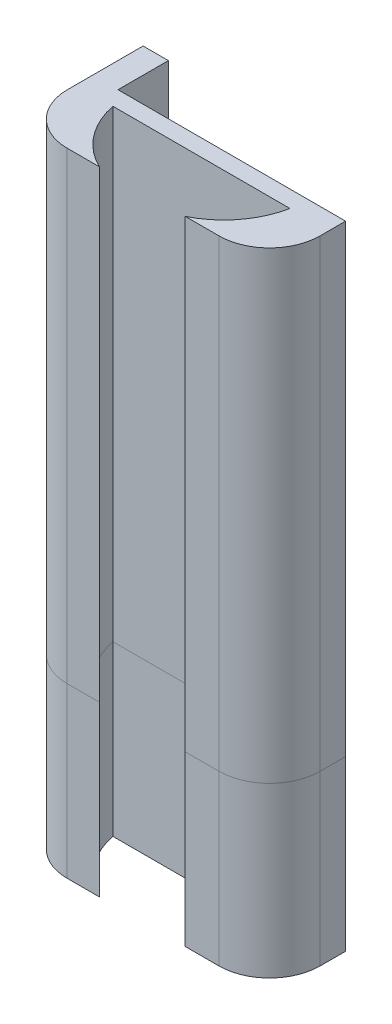
ISO-10303-21;
HEADER;
FILE_DESCRIPTION(('STEP AP214'),'2;1');
FILE_NAME('part.step','',(''),(''),'','','');
FILE_SCHEMA(('AUTOMOTIVE_DESIGN { 1 0 10303 214 1 1 1 1 }'));
ENDSEC;
DATA;
#1=APPLICATION_CONTEXT('core data for automotive mechanical design processes');
#2=APPLICATION_PROTOCOL_DEFINITION('international standard','automotive_design',2000,#1);
#3=PRODUCT_CONTEXT('',#1,'mechanical');
#4=PRODUCT('Part','Part','',(#3));
#5=PRODUCT_RELATED_PRODUCT_CATEGORY('part','',(#4));
#6=PRODUCT_DEFINITION_FORMATION('','',#4);
#7=PRODUCT_DEFINITION_CONTEXT('part definition',#1,'design');
#8=PRODUCT_DEFINITION('design','',#6,#7);
#9=PRODUCT_DEFINITION_SHAPE('','',#8);
#10=(LENGTH_UNIT() NAMED_UNIT(*) SI_UNIT(.MILLI.,.METRE.));
#11=(NAMED_UNIT(*) PLANE_ANGLE_UNIT() SI_UNIT($,.RADIAN.));
#12=(NAMED_UNIT(*) SI_UNIT($,.STERADIAN.) SOLID_ANGLE_UNIT());
#13=UNCERTAINTY_MEASURE_WITH_UNIT(LENGTH_MEASURE(1.E-05),#10,'distance_accuracy_value','');
#14=(GEOMETRIC_REPRESENTATION_CONTEXT(3) GLOBAL_UNCERTAINTY_ASSIGNED_CONTEXT((#13)) GLOBAL_UNIT_ASSIGNED_CONTEXT((#10,
#11,#12)) REPRESENTATION_CONTEXT('',''));
#15=CARTESIAN_POINT('',(0.,0.,0.));
#16=DIRECTION('',(0.,0.,1.));
#17=DIRECTION('',(1.,0.,0.));
#18=AXIS2_PLACEMENT_3D('',#15,#16,#17);
#19=CARTESIAN_POINT('',(-15.,-17.5,15.01));
#20=DIRECTION('',(0.,1.,0.));
#21=DIRECTION('',(0.,0.,1.));
#22=AXIS2_PLACEMENT_3D('',#19,#20,#21);
#23=PLANE('',#22);
#24=DIRECTION('',(1.,0.,0.));
#25=VECTOR('',#24,1.);
#26=CARTESIAN_POINT('',(12.,-17.5,5.98));
#27=LINE('',#26,#25);
#28=CARTESIAN_POINT('',(-12.,-17.5,5.98));
#29=VERTEX_POINT('',#28);
#30=CARTESIAN_POINT('',(15.,-17.5,5.98));
#31=VERTEX_POINT('',#30);
#32=EDGE_CURVE('E156',#29,#31,#27,.T.);
#33=ORIENTED_EDGE('',*,*,#32,.F.);
#34=DIRECTION('',(0.,0.,-1.));
#35=VECTOR('',#34,1.);
#36=CARTESIAN_POINT('',(-12.,-17.5,0.));
#37=LINE('',#36,#35);
#38=CARTESIAN_POINT('',(-12.,-17.5,0.));
#39=VERTEX_POINT('',#38);
#40=EDGE_CURVE('E166',#29,#39,#37,.T.);
#41=ORIENTED_EDGE('',*,*,#40,.T.);
#42=DIRECTION('',(1.,0.,0.));
#43=VECTOR('',#42,1.);
#44=CARTESIAN_POINT('',(0.,-17.5,0.));
#45=LINE('',#44,#43);
#46=CARTESIAN_POINT('',(-15.,-17.5,0.));
#47=VERTEX_POINT('',#46);
#48=EDGE_CURVE('E170',#47,#39,#45,.T.);
#49=ORIENTED_EDGE('',*,*,#48,.F.);
#50=DIRECTION('',(0.,0.,-1.));
#51=VECTOR('',#50,1.);
#52=CARTESIAN_POINT('',(-15.,-17.5,15.));
#53=LINE('',#52,#51);
#54=CARTESIAN_POINT('',(-15.,-17.5,9.));
#55=VERTEX_POINT('',#54);
#56=EDGE_CURVE('E258',#55,#47,#53,.T.);
#57=ORIENTED_EDGE('',*,*,#56,.F.);
#58=CARTESIAN_POINT('',(-9.,-17.5,9.));
#59=DIRECTION('',(0.,1.,0.));
#60=DIRECTION('',(0.,0.,1.));
#61=AXIS2_PLACEMENT_3D('',#58,#59,#60);
#62=CIRCLE('',#61,6.);
#63=CARTESIAN_POINT('',(-9.,-17.5,15.));
#64=VERTEX_POINT('',#63);
#65=EDGE_CURVE('E249',#64,#55,#62,.F.);
#66=ORIENTED_EDGE('',*,*,#65,.F.);
#67=DIRECTION('',(1.,0.,0.));
#68=VECTOR('',#67,1.);
#69=CARTESIAN_POINT('',(0.,-17.5,15.));
#70=LINE('',#69,#68);
#71=CARTESIAN_POINT('',(-5.2,-17.5,15.));
#72=VERTEX_POINT('',#71);
#73=EDGE_CURVE('E176',#64,#72,#70,.T.);
#74=ORIENTED_EDGE('',*,*,#73,.T.);
#75=CARTESIAN_POINT('',(-0.793300427736587,-17.5,6.02330802133584));
#76=DIRECTION('',(0.,1.,0.));
#77=DIRECTION('',(0.,0.,1.));
#78=AXIS2_PLACEMENT_3D('',#75,#76,#77);
#79=CIRCLE('',#78,10.);
#80=CARTESIAN_POINT('',(-10.6,-17.5,7.98));
#81=VERTEX_POINT('',#80);
#82=EDGE_CURVE('E253',#81,#72,#79,.T.);
#83=ORIENTED_EDGE('',*,*,#82,.F.);
#84=DIRECTION('',(-1.,0.,0.));
#85=VECTOR('',#84,1.);
#86=CARTESIAN_POINT('',(0.,-17.5,7.98));
#87=LINE('',#86,#85);
#88=CARTESIAN_POINT('',(10.4,-17.5,7.98));
#89=VERTEX_POINT('',#88);
#90=EDGE_CURVE('E251',#89,#81,#87,.T.);
#91=ORIENTED_EDGE('',*,*,#90,.F.);
#92=CARTESIAN_POINT('',(0.593300427736594,-17.5,6.02330802133584));
#93=DIRECTION('',(0.,1.,0.));
#94=DIRECTION('',(0.,0.,1.));
#95=AXIS2_PLACEMENT_3D('',#92,#93,#94);
#96=CIRCLE('',#95,10.);
#97=CARTESIAN_POINT('',(5.,-17.5,15.));
#98=VERTEX_POINT('',#97);
#99=EDGE_CURVE('E169',#98,#89,#96,.T.);
#100=ORIENTED_EDGE('',*,*,#99,.F.);
#101=DIRECTION('',(1.,0.,0.));
#102=VECTOR('',#101,1.);
#103=CARTESIAN_POINT('',(0.,-17.5,15.));
#104=LINE('',#103,#102);
#105=CARTESIAN_POINT('',(9.,-17.5,15.));
#106=VERTEX_POINT('',#105);
#107=EDGE_CURVE('E261',#98,#106,#104,.T.);
#108=ORIENTED_EDGE('',*,*,#107,.T.);
#109=CARTESIAN_POINT('',(9.,-17.5,9.));
#110=DIRECTION('',(0.,1.,0.));
#111=DIRECTION('',(0.,0.,1.));
#112=AXIS2_PLACEMENT_3D('',#109,#110,#111);
#113=CIRCLE('',#112,6.);
#114=CARTESIAN_POINT('',(15.,-17.5,9.));
#115=VERTEX_POINT('',#114);
#116=EDGE_CURVE('E183',#115,#106,#113,.F.);
#117=ORIENTED_EDGE('',*,*,#116,.F.);
#118=DIRECTION('',(0.,0.,-1.));
#119=VECTOR('',#118,1.);
#120=CARTESIAN_POINT('',(15.,-17.5,15.));
#121=LINE('',#120,#119);
#122=EDGE_CURVE('E168',#115,#31,#121,.T.);
#123=ORIENTED_EDGE('',*,*,#122,.T.);
#124=EDGE_LOOP('',(#33,#41,#49,#57,#66,#74,#83,#91,#100,#108,#117,#123));
#125=FACE_BOUND('',#124,.T.);
#126=ADVANCED_FACE('F49',(#125),#23,.T.);
#127=CARTESIAN_POINT('',(0.,0.,0.));
#128=DIRECTION('',(0.,0.,-1.));
#129=DIRECTION('',(-1.,0.,0.));
#130=AXIS2_PLACEMENT_3D('',#127,#128,#129);
#131=PLANE('',#130);
#132=DIRECTION('',(0.,1.,0.));
#133=VECTOR('',#132,1.);
#134=CARTESIAN_POINT('',(-15.,-37.5,0.));
#135=LINE('',#134,#133);
#136=CARTESIAN_POINT('',(-15.,-37.5,0.));
#137=VERTEX_POINT('',#136);
#138=EDGE_CURVE('E194',#137,#47,#135,.T.);
#139=ORIENTED_EDGE('',*,*,#138,.T.);
#140=ORIENTED_EDGE('',*,*,#48,.T.);
#141=DIRECTION('',(0.,1.,0.));
#142=VECTOR('',#141,1.);
#143=CARTESIAN_POINT('',(-12.,-37.5,0.));
#144=LINE('',#143,#142);
#145=CARTESIAN_POINT('',(-12.,-37.5,0.));
#146=VERTEX_POINT('',#145);
#147=EDGE_CURVE('E163',#146,#39,#144,.T.);
#148=ORIENTED_EDGE('',*,*,#147,.F.);
#149=DIRECTION('',(-1.,0.,0.));
#150=VECTOR('',#149,1.);
#151=CARTESIAN_POINT('',(15.,-37.5,0.));
#152=LINE('',#151,#150);
#153=EDGE_CURVE('E197',#146,#137,#152,.T.);
#154=ORIENTED_EDGE('',*,*,#153,.T.);
#155=EDGE_LOOP('',(#139,#140,#148,#154));
#156=FACE_BOUND('',#155,.T.);
#157=ADVANCED_FACE('F314',(#156),#131,.T.);
#158=CARTESIAN_POINT('',(15.,-37.5,15.));
#159=DIRECTION('',(0.,-1.,0.));
#160=DIRECTION('',(0.,0.,-1.));
#161=AXIS2_PLACEMENT_3D('',#158,#159,#160);
#162=PLANE('',#161);
#163=DIRECTION('',(-1.,0.,0.));
#164=VECTOR('',#163,1.);
#165=CARTESIAN_POINT('',(12.,-37.5,5.98));
#166=LINE('',#165,#164);
#167=CARTESIAN_POINT('',(15.,-37.5,5.98));
#168=VERTEX_POINT('',#167);
#169=CARTESIAN_POINT('',(-12.,-37.5,5.98));
#170=VERTEX_POINT('',#169);
#171=EDGE_CURVE('E158',#168,#170,#166,.T.);
#172=ORIENTED_EDGE('',*,*,#171,.F.);
#173=DIRECTION('',(0.,0.,-1.));
#174=VECTOR('',#173,1.);
#175=CARTESIAN_POINT('',(15.,-37.5,15.));
#176=LINE('',#175,#174);
#177=CARTESIAN_POINT('',(15.,-37.5,9.));
#178=VERTEX_POINT('',#177);
#179=EDGE_CURVE('E193',#178,#168,#176,.T.);
#180=ORIENTED_EDGE('',*,*,#179,.F.);
#181=CARTESIAN_POINT('',(9.,-37.5,9.));
#182=DIRECTION('',(0.,-1.,0.));
#183=DIRECTION('',(0.,0.,-1.));
#184=AXIS2_PLACEMENT_3D('',#181,#182,#183);
#185=CIRCLE('',#184,6.);
#186=CARTESIAN_POINT('',(9.,-37.5,15.));
#187=VERTEX_POINT('',#186);
#188=EDGE_CURVE('E190',#178,#187,#185,.T.);
#189=ORIENTED_EDGE('',*,*,#188,.T.);
#190=DIRECTION('',(-1.,0.,0.));
#191=VECTOR('',#190,1.);
#192=CARTESIAN_POINT('',(15.,-37.5,15.));
#193=LINE('',#192,#191);
#194=CARTESIAN_POINT('',(5.,-37.5,15.));
#195=VERTEX_POINT('',#194);
#196=EDGE_CURVE('E291',#187,#195,#193,.T.);
#197=ORIENTED_EDGE('',*,*,#196,.T.);
#198=CARTESIAN_POINT('',(0.593300427736594,-37.5,6.02330802133584));
#199=DIRECTION('',(0.,1.,0.));
#200=DIRECTION('',(0.,0.,1.));
#201=AXIS2_PLACEMENT_3D('',#198,#199,#200);
#202=CIRCLE('',#201,10.);
#203=CARTESIAN_POINT('',(10.4,-37.5,7.98));
#204=VERTEX_POINT('',#203);
#205=EDGE_CURVE('E216',#204,#195,#202,.F.);
#206=ORIENTED_EDGE('',*,*,#205,.F.);
#207=DIRECTION('',(1.,0.,0.));
#208=VECTOR('',#207,1.);
#209=CARTESIAN_POINT('',(0.,-37.5,7.98));
#210=LINE('',#209,#208);
#211=CARTESIAN_POINT('',(-10.6,-37.5,7.98));
#212=VERTEX_POINT('',#211);
#213=EDGE_CURVE('E221',#212,#204,#210,.T.);
#214=ORIENTED_EDGE('',*,*,#213,.F.);
#215=CARTESIAN_POINT('',(-0.793300427736587,-37.5,6.02330802133584));
#216=DIRECTION('',(0.,1.,0.));
#217=DIRECTION('',(0.,0.,1.));
#218=AXIS2_PLACEMENT_3D('',#215,#216,#217);
#219=CIRCLE('',#218,10.);
#220=CARTESIAN_POINT('',(-5.2,-37.5,15.));
#221=VERTEX_POINT('',#220);
#222=EDGE_CURVE('E211',#221,#212,#219,.F.);
#223=ORIENTED_EDGE('',*,*,#222,.F.);
#224=CARTESIAN_POINT('',(-9.,-37.5,15.));
#225=VERTEX_POINT('',#224);
#226=EDGE_CURVE('E198',#221,#225,#193,.T.);
#227=ORIENTED_EDGE('',*,*,#226,.T.);
#228=CARTESIAN_POINT('',(-9.,-37.5,9.));
#229=DIRECTION('',(0.,-1.,0.));
#230=DIRECTION('',(0.,0.,-1.));
#231=AXIS2_PLACEMENT_3D('',#228,#229,#230);
#232=CIRCLE('',#231,6.);
#233=CARTESIAN_POINT('',(-15.,-37.5,9.));
#234=VERTEX_POINT('',#233);
#235=EDGE_CURVE('E186',#225,#234,#232,.T.);
#236=ORIENTED_EDGE('',*,*,#235,.T.);
#237=DIRECTION('',(0.,0.,-1.));
#238=VECTOR('',#237,1.);
#239=CARTESIAN_POINT('',(-15.,-37.5,15.));
#240=LINE('',#239,#238);
#241=EDGE_CURVE('E299',#234,#137,#240,.T.);
#242=ORIENTED_EDGE('',*,*,#241,.T.);
#243=ORIENTED_EDGE('',*,*,#153,.F.);
#244=DIRECTION('',(0.,0.,1.));
#245=VECTOR('',#244,1.);
#246=CARTESIAN_POINT('',(-12.,-37.5,0.));
#247=LINE('',#246,#245);
#248=EDGE_CURVE('E212',#146,#170,#247,.T.);
#249=ORIENTED_EDGE('',*,*,#248,.T.);
#250=EDGE_LOOP('',(#172,#180,#189,#197,#206,#214,#223,#227,#236,#242,#243,#249));
#251=FACE_BOUND('',#250,.T.);
#252=ADVANCED_FACE('F277',(#251),#162,.T.);
#253=CARTESIAN_POINT('',(0.,0.,15.));
#254=DIRECTION('',(0.,0.,-1.));
#255=DIRECTION('',(-1.,0.,0.));
#256=AXIS2_PLACEMENT_3D('',#253,#254,#255);
#257=PLANE('',#256);
#258=ORIENTED_EDGE('',*,*,#107,.F.);
#259=DIRECTION('',(0.,1.,0.));
#260=VECTOR('',#259,1.);
#261=CARTESIAN_POINT('',(5.,-37.5,15.));
#262=LINE('',#261,#260);
#263=EDGE_CURVE('E199',#195,#98,#262,.T.);
#264=ORIENTED_EDGE('',*,*,#263,.F.);
#265=ORIENTED_EDGE('',*,*,#196,.F.);
#266=DIRECTION('',(0.,1.,0.));
#267=VECTOR('',#266,1.);
#268=CARTESIAN_POINT('',(9.,0.,15.));
#269=LINE('',#268,#267);
#270=EDGE_CURVE('E182',#187,#106,#269,.T.);
#271=ORIENTED_EDGE('',*,*,#270,.T.);
#272=EDGE_LOOP('',(#258,#264,#265,#271));
#273=FACE_BOUND('',#272,.T.);
#274=ADVANCED_FACE('F288',(#273),#257,.F.);
#275=CARTESIAN_POINT('',(15.,-37.5,15.));
#276=DIRECTION('',(-1.,0.,0.));
#277=DIRECTION('',(0.,0.,1.));
#278=AXIS2_PLACEMENT_3D('',#275,#276,#277);
#279=PLANE('',#278);
#280=ORIENTED_EDGE('',*,*,#122,.F.);
#281=DIRECTION('',(0.,1.,0.));
#282=VECTOR('',#281,1.);
#283=CARTESIAN_POINT('',(15.,-37.5,9.));
#284=LINE('',#283,#282);
#285=EDGE_CURVE('E180',#115,#178,#284,.F.);
#286=ORIENTED_EDGE('',*,*,#285,.T.);
#287=ORIENTED_EDGE('',*,*,#179,.T.);
#288=DIRECTION('',(0.,-1.,0.));
#289=VECTOR('',#288,1.);
#290=CARTESIAN_POINT('',(15.,37.5,5.98));
#291=LINE('',#290,#289);
#292=EDGE_CURVE('E12',#31,#168,#291,.T.);
#293=ORIENTED_EDGE('',*,*,#292,.F.);
#294=EDGE_LOOP('',(#280,#286,#287,#293));
#295=FACE_BOUND('',#294,.T.);
#296=ADVANCED_FACE('F296',(#295),#279,.F.);
#297=CARTESIAN_POINT('',(9.,0.,9.));
#298=DIRECTION('',(0.,1.,0.));
#299=DIRECTION('',(0.,0.,1.));
#300=AXIS2_PLACEMENT_3D('',#297,#298,#299);
#301=CYLINDRICAL_SURFACE('',#300,6.);
#302=ORIENTED_EDGE('',*,*,#285,.F.);
#303=ORIENTED_EDGE('',*,*,#116,.T.);
#304=ORIENTED_EDGE('',*,*,#270,.F.);
#305=ORIENTED_EDGE('',*,*,#188,.F.);
#306=EDGE_LOOP('',(#302,#303,#304,#305));
#307=FACE_BOUND('',#306,.T.);
#308=ADVANCED_FACE('F51',(#307),#301,.T.);
#309=CARTESIAN_POINT('',(-15.,-37.5,15.));
#310=DIRECTION('',(-1.,0.,0.));
#311=DIRECTION('',(0.,0.,1.));
#312=AXIS2_PLACEMENT_3D('',#309,#310,#311);
#313=PLANE('',#312);
#314=CARTESIAN_POINT('',(-15.,-22.5,2.5));
#315=DIRECTION('',(1.,0.,0.));
#316=DIRECTION('',(0.,0.,-1.));
#317=AXIS2_PLACEMENT_3D('',#314,#315,#316);
#318=CIRCLE('',#317,1.6);
#319=CARTESIAN_POINT('',(-15.,-21.2500076643625,3.49875881014761));
#320=VERTEX_POINT('',#319);
#321=CARTESIAN_POINT('',(-15.,-21.2499870659514,1.50126697025117));
#322=VERTEX_POINT('',#321);
#323=EDGE_CURVE('E57',#320,#322,#318,.T.);
#324=ORIENTED_EDGE('',*,*,#323,.T.);
#325=DIRECTION('',(0.,0.780935629415864,0.624611513429627));
#326=VECTOR('',#325,1.);
#327=CARTESIAN_POINT('',(-15.,-20.0012969754938,2.5));
#328=LINE('',#327,#326);
#329=CARTESIAN_POINT('',(-15.,-20.0012969754938,2.5));
#330=VERTEX_POINT('',#329);
#331=EDGE_CURVE('E243',#322,#330,#328,.T.);
#332=ORIENTED_EDGE('',*,*,#331,.T.);
#333=DIRECTION('',(0.,-0.780932790791771,0.62461506247142));
#334=VECTOR('',#333,1.);
#335=CARTESIAN_POINT('',(-15.,-20.0012969754938,2.5));
#336=LINE('',#335,#334);
#337=EDGE_CURVE('E235',#330,#320,#336,.T.);
#338=ORIENTED_EDGE('',*,*,#337,.T.);
#339=EDGE_LOOP('',(#324,#332,#338));
#340=FACE_BOUND('',#339,.T.);
#341=DIRECTION('',(0.,1.,0.));
#342=VECTOR('',#341,1.);
#343=CARTESIAN_POINT('',(-15.,37.5,9.));
#344=LINE('',#343,#342);
#345=EDGE_CURVE('E189',#234,#55,#344,.T.);
#346=ORIENTED_EDGE('',*,*,#345,.T.);
#347=ORIENTED_EDGE('',*,*,#56,.T.);
#348=ORIENTED_EDGE('',*,*,#138,.F.);
#349=ORIENTED_EDGE('',*,*,#241,.F.);
#350=EDGE_LOOP('',(#346,#347,#348,#349));
#351=FACE_BOUND('',#350,.T.);
#352=ADVANCED_FACE('F311',(#340,#351),#313,.T.);
#353=ORIENTED_EDGE('',*,*,#73,.F.);
#354=DIRECTION('',(0.,1.,0.));
#355=VECTOR('',#354,1.);
#356=CARTESIAN_POINT('',(-9.,-37.5,15.));
#357=LINE('',#356,#355);
#358=EDGE_CURVE('E187',#64,#225,#357,.F.);
#359=ORIENTED_EDGE('',*,*,#358,.T.);
#360=ORIENTED_EDGE('',*,*,#226,.F.);
#361=DIRECTION('',(0.,1.,0.));
#362=VECTOR('',#361,1.);
#363=CARTESIAN_POINT('',(-5.2,-37.5,15.));
#364=LINE('',#363,#362);
#365=EDGE_CURVE('E202',#221,#72,#364,.T.);
#366=ORIENTED_EDGE('',*,*,#365,.T.);
#367=EDGE_LOOP('',(#353,#359,#360,#366));
#368=FACE_BOUND('',#367,.T.);
#369=ADVANCED_FACE('F270',(#368),#257,.F.);
#370=CARTESIAN_POINT('',(-9.,-37.5,9.));
#371=DIRECTION('',(0.,-1.,0.));
#372=DIRECTION('',(0.,0.,-1.));
#373=AXIS2_PLACEMENT_3D('',#370,#371,#372);
#374=CYLINDRICAL_SURFACE('',#373,6.);
#375=ORIENTED_EDGE('',*,*,#358,.F.);
#376=ORIENTED_EDGE('',*,*,#65,.T.);
#377=ORIENTED_EDGE('',*,*,#345,.F.);
#378=ORIENTED_EDGE('',*,*,#235,.F.);
#379=EDGE_LOOP('',(#375,#376,#377,#378));
#380=FACE_BOUND('',#379,.T.);
#381=ADVANCED_FACE('F312',(#380),#374,.T.);
#382=CARTESIAN_POINT('',(-0.793300427736587,-37.5,6.02330802133584));
#383=DIRECTION('',(0.,1.,0.));
#384=DIRECTION('',(0.,0.,1.));
#385=AXIS2_PLACEMENT_3D('',#382,#383,#384);
#386=CYLINDRICAL_SURFACE('',#385,10.);
#387=DIRECTION('',(0.,1.,0.));
#388=VECTOR('',#387,1.);
#389=CARTESIAN_POINT('',(-10.6,-37.5,7.98));
#390=LINE('',#389,#388);
#391=EDGE_CURVE('E205',#212,#81,#390,.T.);
#392=ORIENTED_EDGE('',*,*,#391,.T.);
#393=ORIENTED_EDGE('',*,*,#82,.T.);
#394=ORIENTED_EDGE('',*,*,#365,.F.);
#395=ORIENTED_EDGE('',*,*,#222,.T.);
#396=EDGE_LOOP('',(#392,#393,#394,#395));
#397=FACE_BOUND('',#396,.T.);
#398=ADVANCED_FACE('F274',(#397),#386,.F.);
#399=CARTESIAN_POINT('',(0.593300427736594,-37.5,6.02330802133584));
#400=DIRECTION('',(0.,1.,0.));
#401=DIRECTION('',(0.,0.,1.));
#402=AXIS2_PLACEMENT_3D('',#399,#400,#401);
#403=CYLINDRICAL_SURFACE('',#402,10.);
#404=ORIENTED_EDGE('',*,*,#263,.T.);
#405=ORIENTED_EDGE('',*,*,#99,.T.);
#406=DIRECTION('',(0.,1.,0.));
#407=VECTOR('',#406,1.);
#408=CARTESIAN_POINT('',(10.4,-37.5,7.98));
#409=LINE('',#408,#407);
#410=EDGE_CURVE('E208',#204,#89,#409,.T.);
#411=ORIENTED_EDGE('',*,*,#410,.F.);
#412=ORIENTED_EDGE('',*,*,#205,.T.);
#413=EDGE_LOOP('',(#404,#405,#411,#412));
#414=FACE_BOUND('',#413,.T.);
#415=ADVANCED_FACE('F284',(#414),#403,.F.);
#416=CARTESIAN_POINT('',(0.,-37.5,7.98));
#417=DIRECTION('',(0.,0.,1.));
#418=DIRECTION('',(1.,0.,0.));
#419=AXIS2_PLACEMENT_3D('',#416,#417,#418);
#420=PLANE('',#419);
#421=ORIENTED_EDGE('',*,*,#410,.T.);
#422=ORIENTED_EDGE('',*,*,#90,.T.);
#423=ORIENTED_EDGE('',*,*,#391,.F.);
#424=ORIENTED_EDGE('',*,*,#213,.T.);
#425=EDGE_LOOP('',(#421,#422,#423,#424));
#426=FACE_BOUND('',#425,.T.);
#427=ADVANCED_FACE('F282',(#426),#420,.T.);
#428=CARTESIAN_POINT('',(12.,-37.5,5.98));
#429=DIRECTION('',(0.,0.,-1.));
#430=DIRECTION('',(-1.,0.,0.));
#431=AXIS2_PLACEMENT_3D('',#428,#429,#430);
#432=PLANE('',#431);
#433=DIRECTION('',(0.,1.,0.));
#434=VECTOR('',#433,1.);
#435=CARTESIAN_POINT('',(-12.,-37.5,5.98));
#436=LINE('',#435,#434);
#437=EDGE_CURVE('E153',#170,#29,#436,.T.);
#438=ORIENTED_EDGE('',*,*,#437,.T.);
#439=ORIENTED_EDGE('',*,*,#32,.T.);
#440=ORIENTED_EDGE('',*,*,#292,.T.);
#441=ORIENTED_EDGE('',*,*,#171,.T.);
#442=EDGE_LOOP('',(#438,#439,#440,#441));
#443=FACE_BOUND('',#442,.T.);
#444=ADVANCED_FACE('F155',(#443),#432,.T.);
#445=CARTESIAN_POINT('',(-15.,-20.0012969754938,2.5));
#446=DIRECTION('',(0.,0.62461506247142,0.780932790791771));
#447=DIRECTION('',(0.,-0.780932790791771,0.62461506247142));
#448=AXIS2_PLACEMENT_3D('',#445,#446,#447);
#449=PLANE('',#448);
#450=DIRECTION('',(1.,0.,0.));
#451=VECTOR('',#450,1.);
#452=CARTESIAN_POINT('',(-15.,-21.2500076643625,3.49875881014761));
#453=LINE('',#452,#451);
#454=CARTESIAN_POINT('',(-12.,-21.2500076643625,3.49875881014761));
#455=VERTEX_POINT('',#454);
#456=EDGE_CURVE('E233',#320,#455,#453,.T.);
#457=ORIENTED_EDGE('',*,*,#456,.F.);
#458=ORIENTED_EDGE('',*,*,#337,.F.);
#459=DIRECTION('',(1.,0.,0.));
#460=VECTOR('',#459,1.);
#461=CARTESIAN_POINT('',(-15.,-20.0012969754938,2.5));
#462=LINE('',#461,#460);
#463=CARTESIAN_POINT('',(-12.,-20.0012969754938,2.5));
#464=VERTEX_POINT('',#463);
#465=EDGE_CURVE('E236',#330,#464,#462,.T.);
#466=ORIENTED_EDGE('',*,*,#465,.T.);
#467=DIRECTION('',(0.,0.780932790791771,-0.62461506247142));
#468=VECTOR('',#467,1.);
#469=CARTESIAN_POINT('',(-12.,-29.4535304627522,10.060199135898));
#470=LINE('',#469,#468);
#471=EDGE_CURVE('E227',#455,#464,#470,.T.);
#472=ORIENTED_EDGE('',*,*,#471,.F.);
#473=EDGE_LOOP('',(#457,#458,#466,#472));
#474=FACE_BOUND('',#473,.T.);
#475=ADVANCED_FACE('F328',(#474),#449,.F.);
#476=CARTESIAN_POINT('',(-15.,-22.5,2.5));
#477=DIRECTION('',(1.,0.,0.));
#478=DIRECTION('',(0.,0.,-1.));
#479=AXIS2_PLACEMENT_3D('',#476,#477,#478);
#480=CYLINDRICAL_SURFACE('',#479,1.6);
#481=DIRECTION('',(1.,0.,0.));
#482=VECTOR('',#481,1.);
#483=CARTESIAN_POINT('',(-15.,-21.2499870659514,1.50126697025117));
#484=LINE('',#483,#482);
#485=CARTESIAN_POINT('',(-12.,-21.2499870659514,1.50126697025117));
#486=VERTEX_POINT('',#485);
#487=EDGE_CURVE('E70',#322,#486,#484,.T.);
#488=ORIENTED_EDGE('',*,*,#487,.F.);
#489=ORIENTED_EDGE('',*,*,#323,.F.);
#490=ORIENTED_EDGE('',*,*,#456,.T.);
#491=CARTESIAN_POINT('',(-12.,-22.5,2.5));
#492=DIRECTION('',(-1.,0.,0.));
#493=DIRECTION('',(0.,0.,1.));
#494=AXIS2_PLACEMENT_3D('',#491,#492,#493);
#495=CIRCLE('',#494,1.6);
#496=EDGE_CURVE('E162',#486,#455,#495,.T.);
#497=ORIENTED_EDGE('',*,*,#496,.F.);
#498=EDGE_LOOP('',(#488,#489,#490,#497));
#499=FACE_BOUND('',#498,.T.);
#500=ADVANCED_FACE('F403',(#499),#480,.F.);
#501=CARTESIAN_POINT('',(-15.,-20.0012969754938,2.5));
#502=DIRECTION('',(0.,0.624611513429627,-0.780935629415864));
#503=DIRECTION('',(0.,0.780935629415864,0.624611513429627));
#504=AXIS2_PLACEMENT_3D('',#501,#502,#503);
#505=PLANE('',#504);
#506=ORIENTED_EDGE('',*,*,#465,.F.);
#507=ORIENTED_EDGE('',*,*,#331,.F.);
#508=ORIENTED_EDGE('',*,*,#487,.T.);
#509=DIRECTION('',(0.,-0.780935629415864,-0.624611513429627));
#510=VECTOR('',#509,1.);
#511=CARTESIAN_POINT('',(-12.,-31.8925174674726,-7.01089046042876));
#512=LINE('',#511,#510);
#513=EDGE_CURVE('E230',#464,#486,#512,.T.);
#514=ORIENTED_EDGE('',*,*,#513,.F.);
#515=EDGE_LOOP('',(#506,#507,#508,#514));
#516=FACE_BOUND('',#515,.T.);
#517=ADVANCED_FACE('F331',(#516),#505,.F.);
#518=CARTESIAN_POINT('',(-12.,-37.5,0.));
#519=DIRECTION('',(-1.,0.,0.));
#520=DIRECTION('',(0.,0.,1.));
#521=AXIS2_PLACEMENT_3D('',#518,#519,#520);
#522=PLANE('',#521);
#523=ORIENTED_EDGE('',*,*,#513,.T.);
#524=ORIENTED_EDGE('',*,*,#496,.T.);
#525=ORIENTED_EDGE('',*,*,#471,.T.);
#526=EDGE_LOOP('',(#523,#524,#525));
#527=FACE_BOUND('',#526,.T.);
#528=ORIENTED_EDGE('',*,*,#40,.F.);
#529=ORIENTED_EDGE('',*,*,#437,.F.);
#530=ORIENTED_EDGE('',*,*,#248,.F.);
#531=ORIENTED_EDGE('',*,*,#147,.T.);
#532=EDGE_LOOP('',(#528,#529,#530,#531));
#533=FACE_BOUND('',#532,.T.);
#534=ADVANCED_FACE('F172',(#527,#533),#522,.F.);
#535=CLOSED_SHELL('',(#126,#157,#252,#274,#296,#308,#352,#369,#381,#398,#415,#427,#444,#475,
#500,#517,#534));
#536=MANIFOLD_SOLID_BREP('B2',#535);
#537=CARTESIAN_POINT('',(-15.,-17.5,15.01));
#538=DIRECTION('',(0.,1.,0.));
#539=DIRECTION('',(0.,0.,1.));
#540=AXIS2_PLACEMENT_3D('',#537,#538,#539);
#541=PLANE('',#540);
#542=DIRECTION('',(1.,0.,0.));
#543=VECTOR('',#542,1.);
#544=CARTESIAN_POINT('',(12.,-17.5,5.98));
#545=LINE('',#544,#543);
#546=CARTESIAN_POINT('',(-12.,-17.5,5.98));
#547=VERTEX_POINT('',#546);
#548=CARTESIAN_POINT('',(15.,-17.5,5.98));
#549=VERTEX_POINT('',#548);
#550=EDGE_CURVE('E469',#547,#549,#545,.T.);
#551=ORIENTED_EDGE('',*,*,#550,.T.);
#552=DIRECTION('',(0.,0.,-1.));
#553=VECTOR('',#552,1.);
#554=CARTESIAN_POINT('',(15.,-17.5,15.));
#555=LINE('',#554,#553);
#556=CARTESIAN_POINT('',(15.,-17.5,9.));
#557=VERTEX_POINT('',#556);
#558=EDGE_CURVE('E611',#557,#549,#555,.T.);
#559=ORIENTED_EDGE('',*,*,#558,.F.);
#560=CARTESIAN_POINT('',(9.,-17.5,9.));
#561=DIRECTION('',(0.,1.,0.));
#562=DIRECTION('',(0.,0.,1.));
#563=AXIS2_PLACEMENT_3D('',#560,#561,#562);
#564=CIRCLE('',#563,6.);
#565=CARTESIAN_POINT('',(9.,-17.5,15.));
#566=VERTEX_POINT('',#565);
#567=EDGE_CURVE('E47',#557,#566,#564,.F.);
#568=ORIENTED_EDGE('',*,*,#567,.T.);
#569=DIRECTION('',(1.,0.,0.));
#570=VECTOR('',#569,1.);
#571=CARTESIAN_POINT('',(0.,-17.5,15.));
#572=LINE('',#571,#570);
#573=CARTESIAN_POINT('',(5.,-17.5,15.));
#574=VERTEX_POINT('',#573);
#575=EDGE_CURVE('E488',#574,#566,#572,.T.);
#576=ORIENTED_EDGE('',*,*,#575,.F.);
#577=CARTESIAN_POINT('',(0.593300427736594,-17.5,6.02330802133584));
#578=DIRECTION('',(0.,1.,0.));
#579=DIRECTION('',(0.,0.,1.));
#580=AXIS2_PLACEMENT_3D('',#577,#578,#579);
#581=CIRCLE('',#580,10.);
#582=CARTESIAN_POINT('',(10.4,-17.5,7.98));
#583=VERTEX_POINT('',#582);
#584=EDGE_CURVE('E650',#574,#583,#581,.T.);
#585=ORIENTED_EDGE('',*,*,#584,.T.);
#586=DIRECTION('',(-1.,0.,0.));
#587=VECTOR('',#586,1.);
#588=CARTESIAN_POINT('',(0.,-17.5,7.98));
#589=LINE('',#588,#587);
#590=CARTESIAN_POINT('',(-10.6,-17.5,7.98));
#591=VERTEX_POINT('',#590);
#592=EDGE_CURVE('E654',#583,#591,#589,.T.);
#593=ORIENTED_EDGE('',*,*,#592,.T.);
#594=CARTESIAN_POINT('',(-0.793300427736587,-17.5,6.02330802133584));
#595=DIRECTION('',(0.,1.,0.));
#596=DIRECTION('',(0.,0.,1.));
#597=AXIS2_PLACEMENT_3D('',#594,#595,#596);
#598=CIRCLE('',#597,10.);
#599=CARTESIAN_POINT('',(-5.2,-17.5,15.));
#600=VERTEX_POINT('',#599);
#601=EDGE_CURVE('E653',#591,#600,#598,.T.);
#602=ORIENTED_EDGE('',*,*,#601,.T.);
#603=DIRECTION('',(1.,0.,0.));
#604=VECTOR('',#603,1.);
#605=CARTESIAN_POINT('',(0.,-17.5,15.));
#606=LINE('',#605,#604);
#607=CARTESIAN_POINT('',(-9.,-17.5,15.));
#608=VERTEX_POINT('',#607);
#609=EDGE_CURVE('E648',#608,#600,#606,.T.);
#610=ORIENTED_EDGE('',*,*,#609,.F.);
#611=CARTESIAN_POINT('',(-9.,-17.5,9.));
#612=DIRECTION('',(0.,1.,0.));
#613=DIRECTION('',(0.,0.,1.));
#614=AXIS2_PLACEMENT_3D('',#611,#612,#613);
#615=CIRCLE('',#614,6.);
#616=CARTESIAN_POINT('',(-15.,-17.5,9.));
#617=VERTEX_POINT('',#616);
#618=EDGE_CURVE('E474',#608,#617,#615,.F.);
#619=ORIENTED_EDGE('',*,*,#618,.T.);
#620=DIRECTION('',(0.,0.,-1.));
#621=VECTOR('',#620,1.);
#622=CARTESIAN_POINT('',(-15.,-17.5,15.));
#623=LINE('',#622,#621);
#624=CARTESIAN_POINT('',(-15.,-17.5,0.));
#625=VERTEX_POINT('',#624);
#626=EDGE_CURVE('E644',#617,#625,#623,.T.);
#627=ORIENTED_EDGE('',*,*,#626,.T.);
#628=DIRECTION('',(1.,0.,0.));
#629=VECTOR('',#628,1.);
#630=CARTESIAN_POINT('',(0.,-17.5,0.));
#631=LINE('',#630,#629);
#632=CARTESIAN_POINT('',(-12.,-17.5,0.));
#633=VERTEX_POINT('',#632);
#634=EDGE_CURVE('E641',#625,#633,#631,.T.);
#635=ORIENTED_EDGE('',*,*,#634,.T.);
#636=DIRECTION('',(0.,0.,-1.));
#637=VECTOR('',#636,1.);
#638=CARTESIAN_POINT('',(-12.,-17.5,0.));
#639=LINE('',#638,#637);
#640=EDGE_CURVE('E639',#547,#633,#639,.T.);
#641=ORIENTED_EDGE('',*,*,#640,.F.);
#642=EDGE_LOOP('',(#551,#559,#568,#576,#585,#593,#602,#610,#619,#627,#635,#641));
#643=FACE_BOUND('',#642,.T.);
#644=ADVANCED_FACE('F466',(#643),#541,.F.);
#645=CARTESIAN_POINT('',(15.,37.5,15.));
#646=DIRECTION('',(0.,-1.,0.));
#647=DIRECTION('',(0.,0.,-1.));
#648=AXIS2_PLACEMENT_3D('',#645,#646,#647);
#649=PLANE('',#648);
#650=DIRECTION('',(0.,0.,-1.));
#651=VECTOR('',#650,1.);
#652=CARTESIAN_POINT('',(15.,37.5,15.));
#653=LINE('',#652,#651);
#654=CARTESIAN_POINT('',(15.,37.5,9.));
#655=VERTEX_POINT('',#654);
#656=CARTESIAN_POINT('',(15.,37.5,5.98));
#657=VERTEX_POINT('',#656);
#658=EDGE_CURVE('E610',#655,#657,#653,.T.);
#659=ORIENTED_EDGE('',*,*,#658,.T.);
#660=DIRECTION('',(-1.,0.,0.));
#661=VECTOR('',#660,1.);
#662=CARTESIAN_POINT('',(12.,37.5,5.98));
#663=LINE('',#662,#661);
#664=CARTESIAN_POINT('',(-12.,37.5,5.98));
#665=VERTEX_POINT('',#664);
#666=EDGE_CURVE('E592',#657,#665,#663,.T.);
#667=ORIENTED_EDGE('',*,*,#666,.T.);
#668=DIRECTION('',(0.,0.,1.));
#669=VECTOR('',#668,1.);
#670=CARTESIAN_POINT('',(-12.,37.5,0.));
#671=LINE('',#670,#669);
#672=CARTESIAN_POINT('',(-12.,37.5,0.));
#673=VERTEX_POINT('',#672);
#674=EDGE_CURVE('E604',#673,#665,#671,.T.);
#675=ORIENTED_EDGE('',*,*,#674,.F.);
#676=DIRECTION('',(-1.,0.,0.));
#677=VECTOR('',#676,1.);
#678=CARTESIAN_POINT('',(15.,37.5,0.));
#679=LINE('',#678,#677);
#680=CARTESIAN_POINT('',(-15.,37.5,0.));
#681=VERTEX_POINT('',#680);
#682=EDGE_CURVE('E627',#673,#681,#679,.T.);
#683=ORIENTED_EDGE('',*,*,#682,.T.);
#684=DIRECTION('',(0.,0.,-1.));
#685=VECTOR('',#684,1.);
#686=CARTESIAN_POINT('',(-15.,37.5,15.));
#687=LINE('',#686,#685);
#688=CARTESIAN_POINT('',(-15.,37.5,9.));
#689=VERTEX_POINT('',#688);
#690=EDGE_CURVE('E620',#689,#681,#687,.T.);
#691=ORIENTED_EDGE('',*,*,#690,.F.);
#692=CARTESIAN_POINT('',(-9.,37.5,9.));
#693=DIRECTION('',(0.,-1.,0.));
#694=DIRECTION('',(0.,0.,-1.));
#695=AXIS2_PLACEMENT_3D('',#692,#693,#694);
#696=CIRCLE('',#695,6.);
#697=CARTESIAN_POINT('',(-9.,37.5,15.));
#698=VERTEX_POINT('',#697);
#699=EDGE_CURVE('E631',#689,#698,#696,.F.);
#700=ORIENTED_EDGE('',*,*,#699,.T.);
#701=DIRECTION('',(-1.,0.,0.));
#702=VECTOR('',#701,1.);
#703=CARTESIAN_POINT('',(15.,37.5,15.));
#704=LINE('',#703,#702);
#705=CARTESIAN_POINT('',(-5.2,37.5,15.));
#706=VERTEX_POINT('',#705);
#707=EDGE_CURVE('E678',#706,#698,#704,.T.);
#708=ORIENTED_EDGE('',*,*,#707,.F.);
#709=CARTESIAN_POINT('',(-0.793300427736587,37.5,6.02330802133584));
#710=DIRECTION('',(0.,1.,0.));
#711=DIRECTION('',(0.,0.,1.));
#712=AXIS2_PLACEMENT_3D('',#709,#710,#711);
#713=CIRCLE('',#712,10.);
#714=CARTESIAN_POINT('',(-10.6,37.5,7.98));
#715=VERTEX_POINT('',#714);
#716=EDGE_CURVE('E688',#706,#715,#713,.F.);
#717=ORIENTED_EDGE('',*,*,#716,.T.);
#718=DIRECTION('',(1.,0.,0.));
#719=VECTOR('',#718,1.);
#720=CARTESIAN_POINT('',(0.,37.5,7.98));
#721=LINE('',#720,#719);
#722=CARTESIAN_POINT('',(10.4,37.5,7.98));
#723=VERTEX_POINT('',#722);
#724=EDGE_CURVE('E696',#715,#723,#721,.T.);
#725=ORIENTED_EDGE('',*,*,#724,.T.);
#726=CARTESIAN_POINT('',(0.593300427736594,37.5,6.02330802133584));
#727=DIRECTION('',(0.,1.,0.));
#728=DIRECTION('',(0.,0.,1.));
#729=AXIS2_PLACEMENT_3D('',#726,#727,#728);
#730=CIRCLE('',#729,10.);
#731=CARTESIAN_POINT('',(5.,37.5,15.));
#732=VERTEX_POINT('',#731);
#733=EDGE_CURVE('E603',#723,#732,#730,.F.);
#734=ORIENTED_EDGE('',*,*,#733,.T.);
#735=CARTESIAN_POINT('',(9.,37.5,15.));
#736=VERTEX_POINT('',#735);
#737=EDGE_CURVE('E624',#736,#732,#704,.T.);
#738=ORIENTED_EDGE('',*,*,#737,.F.);
#739=CARTESIAN_POINT('',(9.,37.5,9.));
#740=DIRECTION('',(0.,-1.,0.));
#741=DIRECTION('',(0.,0.,-1.));
#742=AXIS2_PLACEMENT_3D('',#739,#740,#741);
#743=CIRCLE('',#742,6.);
#744=EDGE_CURVE('E618',#736,#655,#743,.F.);
#745=ORIENTED_EDGE('',*,*,#744,.T.);
#746=EDGE_LOOP('',(#659,#667,#675,#683,#691,#700,#708,#717,#725,#734,#738,#745));
#747=FACE_BOUND('',#746,.T.);
#748=ADVANCED_FACE('F615',(#747),#649,.F.);
#749=CARTESIAN_POINT('',(0.,0.,15.));
#750=DIRECTION('',(0.,0.,-1.));
#751=DIRECTION('',(-1.,0.,0.));
#752=AXIS2_PLACEMENT_3D('',#749,#750,#751);
#753=PLANE('',#752);
#754=DIRECTION('',(0.,1.,0.));
#755=VECTOR('',#754,1.);
#756=CARTESIAN_POINT('',(5.,-37.5,15.));
#757=LINE('',#756,#755);
#758=EDGE_CURVE('E680',#574,#732,#757,.T.);
#759=ORIENTED_EDGE('',*,*,#758,.F.);
#760=ORIENTED_EDGE('',*,*,#575,.T.);
#761=DIRECTION('',(0.,1.,0.));
#762=VECTOR('',#761,1.);
#763=CARTESIAN_POINT('',(9.,0.,15.));
#764=LINE('',#763,#762);
#765=EDGE_CURVE('E636',#566,#736,#764,.T.);
#766=ORIENTED_EDGE('',*,*,#765,.T.);
#767=ORIENTED_EDGE('',*,*,#737,.T.);
#768=EDGE_LOOP('',(#759,#760,#766,#767));
#769=FACE_BOUND('',#768,.T.);
#770=ADVANCED_FACE('F798',(#769),#753,.F.);
#771=DIRECTION('',(0.,1.,0.));
#772=VECTOR('',#771,1.);
#773=CARTESIAN_POINT('',(-9.,-37.5,15.));
#774=LINE('',#773,#772);
#775=EDGE_CURVE('E633',#698,#608,#774,.F.);
#776=ORIENTED_EDGE('',*,*,#775,.T.);
#777=ORIENTED_EDGE('',*,*,#609,.T.);
#778=DIRECTION('',(0.,1.,0.));
#779=VECTOR('',#778,1.);
#780=CARTESIAN_POINT('',(-5.2,-37.5,15.));
#781=LINE('',#780,#779);
#782=EDGE_CURVE('E681',#600,#706,#781,.T.);
#783=ORIENTED_EDGE('',*,*,#782,.T.);
#784=ORIENTED_EDGE('',*,*,#707,.T.);
#785=EDGE_LOOP('',(#776,#777,#783,#784));
#786=FACE_BOUND('',#785,.T.);
#787=ADVANCED_FACE('F810',(#786),#753,.F.);
#788=CARTESIAN_POINT('',(15.,-37.5,15.));
#789=DIRECTION('',(-1.,0.,0.));
#790=DIRECTION('',(0.,0.,1.));
#791=AXIS2_PLACEMENT_3D('',#788,#789,#790);
#792=PLANE('',#791);
#793=DIRECTION('',(0.,1.,0.));
#794=VECTOR('',#793,1.);
#795=CARTESIAN_POINT('',(15.,-37.5,9.));
#796=LINE('',#795,#794);
#797=EDGE_CURVE('E638',#655,#557,#796,.F.);
#798=ORIENTED_EDGE('',*,*,#797,.T.);
#799=ORIENTED_EDGE('',*,*,#558,.T.);
#800=DIRECTION('',(0.,-1.,0.));
#801=VECTOR('',#800,1.);
#802=CARTESIAN_POINT('',(15.,37.5,5.98));
#803=LINE('',#802,#801);
#804=EDGE_CURVE('E596',#657,#549,#803,.T.);
#805=ORIENTED_EDGE('',*,*,#804,.F.);
#806=ORIENTED_EDGE('',*,*,#658,.F.);
#807=EDGE_LOOP('',(#798,#799,#805,#806));
#808=FACE_BOUND('',#807,.T.);
#809=ADVANCED_FACE('F609',(#808),#792,.F.);
#810=CARTESIAN_POINT('',(-15.,-37.5,15.));
#811=DIRECTION('',(-1.,0.,0.));
#812=DIRECTION('',(0.,0.,1.));
#813=AXIS2_PLACEMENT_3D('',#810,#811,#812);
#814=PLANE('',#813);
#815=ORIENTED_EDGE('',*,*,#626,.F.);
#816=DIRECTION('',(0.,1.,0.));
#817=VECTOR('',#816,1.);
#818=CARTESIAN_POINT('',(-15.,37.5,9.));
#819=LINE('',#818,#817);
#820=EDGE_CURVE('E619',#617,#689,#819,.T.);
#821=ORIENTED_EDGE('',*,*,#820,.T.);
#822=ORIENTED_EDGE('',*,*,#690,.T.);
#823=DIRECTION('',(0.,1.,0.));
#824=VECTOR('',#823,1.);
#825=CARTESIAN_POINT('',(-15.,-37.5,0.));
#826=LINE('',#825,#824);
#827=EDGE_CURVE('E679',#625,#681,#826,.T.);
#828=ORIENTED_EDGE('',*,*,#827,.F.);
#829=EDGE_LOOP('',(#815,#821,#822,#828));
#830=FACE_BOUND('',#829,.T.);
#831=DIRECTION('',(0.,-0.780932790791771,-0.62461506247142));
#832=VECTOR('',#831,1.);
#833=CARTESIAN_POINT('',(-15.,20.0012969754938,2.5));
#834=LINE('',#833,#832);
#835=CARTESIAN_POINT('',(-15.,21.2500076643625,3.49875881014761));
#836=VERTEX_POINT('',#835);
#837=CARTESIAN_POINT('',(-15.,20.0012969754938,2.5));
#838=VERTEX_POINT('',#837);
#839=EDGE_CURVE('E720',#836,#838,#834,.T.);
#840=ORIENTED_EDGE('',*,*,#839,.T.);
#841=DIRECTION('',(0.,0.780935629415864,-0.624611513429627));
#842=VECTOR('',#841,1.);
#843=CARTESIAN_POINT('',(-15.,20.0012969754938,2.5));
#844=LINE('',#843,#842);
#845=CARTESIAN_POINT('',(-15.,21.2499870659514,1.50126697025117));
#846=VERTEX_POINT('',#845);
#847=EDGE_CURVE('E740',#838,#846,#844,.T.);
#848=ORIENTED_EDGE('',*,*,#847,.T.);
#849=CARTESIAN_POINT('',(-15.,22.5,2.5));
#850=DIRECTION('',(1.,0.,0.));
#851=DIRECTION('',(0.,0.,1.));
#852=AXIS2_PLACEMENT_3D('',#849,#850,#851);
#853=CIRCLE('',#852,1.6);
#854=EDGE_CURVE('E743',#846,#836,#853,.T.);
#855=ORIENTED_EDGE('',*,*,#854,.T.);
#856=EDGE_LOOP('',(#840,#848,#855));
#857=FACE_BOUND('',#856,.T.);
#858=CARTESIAN_POINT('',(-15.,0.,2.51533876776998));
#859=DIRECTION('',(1.,0.,0.));
#860=DIRECTION('',(0.,0.,-1.));
#861=AXIS2_PLACEMENT_3D('',#858,#859,#860);
#862=CIRCLE('',#861,1.57655758998591);
#863=CARTESIAN_POINT('',(-15.,0.861958836780222,3.83539967478854));
#864=VERTEX_POINT('',#863);
#865=CARTESIAN_POINT('',(-15.,0.845247167654444,1.18451531587476));
#866=VERTEX_POINT('',#865);
#867=EDGE_CURVE('E721',#864,#866,#862,.T.);
#868=ORIENTED_EDGE('',*,*,#867,.T.);
#869=DIRECTION('',(0.,0.770062449010901,0.637968513818145));
#870=VECTOR('',#869,1.);
#871=CARTESIAN_POINT('',(-15.,2.43310822278886,2.5));
#872=LINE('',#871,#870);
#873=CARTESIAN_POINT('',(-15.,2.43310822278886,2.5));
#874=VERTEX_POINT('',#873);
#875=EDGE_CURVE('E725',#866,#874,#872,.T.);
#876=ORIENTED_EDGE('',*,*,#875,.T.);
#877=DIRECTION('',(0.,-0.761957817429666,0.647626655147717));
#878=VECTOR('',#877,1.);
#879=CARTESIAN_POINT('',(-15.,2.43310822278886,2.5));
#880=LINE('',#879,#878);
#881=EDGE_CURVE('E728',#874,#864,#880,.T.);
#882=ORIENTED_EDGE('',*,*,#881,.T.);
#883=EDGE_LOOP('',(#868,#876,#882));
#884=FACE_BOUND('',#883,.T.);
#885=ADVANCED_FACE('F765',(#830,#857,#884),#814,.T.);
#886=CARTESIAN_POINT('',(0.,0.,0.));
#887=DIRECTION('',(0.,0.,-1.));
#888=DIRECTION('',(-1.,0.,0.));
#889=AXIS2_PLACEMENT_3D('',#886,#887,#888);
#890=PLANE('',#889);
#891=ORIENTED_EDGE('',*,*,#634,.F.);
#892=ORIENTED_EDGE('',*,*,#827,.T.);
#893=ORIENTED_EDGE('',*,*,#682,.F.);
#894=DIRECTION('',(0.,1.,0.));
#895=VECTOR('',#894,1.);
#896=CARTESIAN_POINT('',(-12.,-37.5,0.));
#897=LINE('',#896,#895);
#898=EDGE_CURVE('E664',#633,#673,#897,.T.);
#899=ORIENTED_EDGE('',*,*,#898,.F.);
#900=EDGE_LOOP('',(#891,#892,#893,#899));
#901=FACE_BOUND('',#900,.T.);
#902=ADVANCED_FACE('F669',(#901),#890,.T.);
#903=CARTESIAN_POINT('',(12.,-37.5,5.98));
#904=DIRECTION('',(0.,0.,-1.));
#905=DIRECTION('',(-1.,0.,0.));
#906=AXIS2_PLACEMENT_3D('',#903,#904,#905);
#907=PLANE('',#906);
#908=ORIENTED_EDGE('',*,*,#550,.F.);
#909=DIRECTION('',(0.,1.,0.));
#910=VECTOR('',#909,1.);
#911=CARTESIAN_POINT('',(-12.,-37.5,5.98));
#912=LINE('',#911,#910);
#913=EDGE_CURVE('E598',#547,#665,#912,.T.);
#914=ORIENTED_EDGE('',*,*,#913,.T.);
#915=ORIENTED_EDGE('',*,*,#666,.F.);
#916=ORIENTED_EDGE('',*,*,#804,.T.);
#917=EDGE_LOOP('',(#908,#914,#915,#916));
#918=FACE_BOUND('',#917,.T.);
#919=ADVANCED_FACE('F595',(#918),#907,.T.);
#920=CARTESIAN_POINT('',(-12.,-37.5,0.));
#921=DIRECTION('',(-1.,0.,0.));
#922=DIRECTION('',(0.,0.,1.));
#923=AXIS2_PLACEMENT_3D('',#920,#921,#922);
#924=PLANE('',#923);
#925=DIRECTION('',(0.,-0.780935629415864,0.624611513429627));
#926=VECTOR('',#925,1.);
#927=CARTESIAN_POINT('',(-12.,-13.8470168293638,29.5727134431133));
#928=LINE('',#927,#926);
#929=CARTESIAN_POINT('',(-12.,21.2499870659514,1.50126697025117));
#930=VERTEX_POINT('',#929);
#931=CARTESIAN_POINT('',(-12.,20.0012969754938,2.5));
#932=VERTEX_POINT('',#931);
#933=EDGE_CURVE('E708',#930,#932,#928,.T.);
#934=ORIENTED_EDGE('',*,*,#933,.T.);
#935=DIRECTION('',(0.,0.780932790791771,0.62461506247142));
#936=VECTOR('',#935,1.);
#937=CARTESIAN_POINT('',(-12.,-16.2856713172846,-26.5234796570807));
#938=LINE('',#937,#936);
#939=CARTESIAN_POINT('',(-12.,21.2500076643625,3.49875881014761));
#940=VERTEX_POINT('',#939);
#941=EDGE_CURVE('E673',#932,#940,#938,.T.);
#942=ORIENTED_EDGE('',*,*,#941,.T.);
#943=CARTESIAN_POINT('',(-12.,22.5,2.5));
#944=DIRECTION('',(-1.,0.,0.));
#945=DIRECTION('',(0.,0.,1.));
#946=AXIS2_PLACEMENT_3D('',#943,#944,#945);
#947=CIRCLE('',#946,1.6);
#948=EDGE_CURVE('E705',#940,#930,#947,.T.);
#949=ORIENTED_EDGE('',*,*,#948,.T.);
#950=EDGE_LOOP('',(#934,#942,#949));
#951=FACE_BOUND('',#950,.T.);
#952=DIRECTION('',(0.,-0.770062449010901,-0.637968513818145));
#953=VECTOR('',#952,1.);
#954=CARTESIAN_POINT('',(-12.,-22.4752612145841,-18.1356711095377));
#955=LINE('',#954,#953);
#956=CARTESIAN_POINT('',(-12.,2.43310822278886,2.5));
#957=VERTEX_POINT('',#956);
#958=CARTESIAN_POINT('',(-12.,0.845247167654446,1.18451531587476));
#959=VERTEX_POINT('',#958);
#960=EDGE_CURVE('E717',#957,#959,#955,.T.);
#961=ORIENTED_EDGE('',*,*,#960,.T.);
#962=CARTESIAN_POINT('',(-12.,0.,2.51533876776998));
#963=DIRECTION('',(-1.,0.,0.));
#964=DIRECTION('',(0.,0.,1.));
#965=AXIS2_PLACEMENT_3D('',#962,#963,#964);
#966=CIRCLE('',#965,1.57655758998591);
#967=CARTESIAN_POINT('',(-12.,0.861958836780222,3.83539967478854));
#968=VERTEX_POINT('',#967);
#969=EDGE_CURVE('E711',#959,#968,#966,.T.);
#970=ORIENTED_EDGE('',*,*,#969,.T.);
#971=DIRECTION('',(0.,0.761957817429666,-0.647626655147717));
#972=VECTOR('',#971,1.);
#973=CARTESIAN_POINT('',(-12.,-19.5175839082489,21.1570082986432));
#974=LINE('',#973,#972);
#975=EDGE_CURVE('E714',#968,#957,#974,.T.);
#976=ORIENTED_EDGE('',*,*,#975,.T.);
#977=EDGE_LOOP('',(#961,#970,#976));
#978=FACE_BOUND('',#977,.T.);
#979=ORIENTED_EDGE('',*,*,#913,.F.);
#980=ORIENTED_EDGE('',*,*,#640,.T.);
#981=ORIENTED_EDGE('',*,*,#898,.T.);
#982=ORIENTED_EDGE('',*,*,#674,.T.);
#983=EDGE_LOOP('',(#979,#980,#981,#982));
#984=FACE_BOUND('',#983,.T.);
#985=ADVANCED_FACE('F662',(#951,#978,#984),#924,.F.);
#986=CARTESIAN_POINT('',(0.593300427736594,-37.5,6.02330802133584));
#987=DIRECTION('',(0.,1.,0.));
#988=DIRECTION('',(0.,0.,1.));
#989=AXIS2_PLACEMENT_3D('',#986,#987,#988);
#990=CYLINDRICAL_SURFACE('',#989,10.);
#991=ORIENTED_EDGE('',*,*,#584,.F.);
#992=ORIENTED_EDGE('',*,*,#758,.T.);
#993=ORIENTED_EDGE('',*,*,#733,.F.);
#994=DIRECTION('',(0.,1.,0.));
#995=VECTOR('',#994,1.);
#996=CARTESIAN_POINT('',(10.4,-37.5,7.98));
#997=LINE('',#996,#995);
#998=EDGE_CURVE('E691',#583,#723,#997,.T.);
#999=ORIENTED_EDGE('',*,*,#998,.F.);
#1000=EDGE_LOOP('',(#991,#992,#993,#999));
#1001=FACE_BOUND('',#1000,.T.);
#1002=ADVANCED_FACE('F781',(#1001),#990,.F.);
#1003=CARTESIAN_POINT('',(-0.793300427736587,-37.5,6.02330802133584));
#1004=DIRECTION('',(0.,1.,0.));
#1005=DIRECTION('',(0.,0.,1.));
#1006=AXIS2_PLACEMENT_3D('',#1003,#1004,#1005);
#1007=CYLINDRICAL_SURFACE('',#1006,10.);
#1008=ORIENTED_EDGE('',*,*,#601,.F.);
#1009=DIRECTION('',(0.,1.,0.));
#1010=VECTOR('',#1009,1.);
#1011=CARTESIAN_POINT('',(-10.6,-37.5,7.98));
#1012=LINE('',#1011,#1010);
#1013=EDGE_CURVE('E685',#591,#715,#1012,.T.);
#1014=ORIENTED_EDGE('',*,*,#1013,.T.);
#1015=ORIENTED_EDGE('',*,*,#716,.F.);
#1016=ORIENTED_EDGE('',*,*,#782,.F.);
#1017=EDGE_LOOP('',(#1008,#1014,#1015,#1016));
#1018=FACE_BOUND('',#1017,.T.);
#1019=ADVANCED_FACE('F787',(#1018),#1007,.F.);
#1020=CARTESIAN_POINT('',(0.,-37.5,7.98));
#1021=DIRECTION('',(0.,0.,1.));
#1022=DIRECTION('',(1.,0.,0.));
#1023=AXIS2_PLACEMENT_3D('',#1020,#1021,#1022);
#1024=PLANE('',#1023);
#1025=ORIENTED_EDGE('',*,*,#592,.F.);
#1026=ORIENTED_EDGE('',*,*,#998,.T.);
#1027=ORIENTED_EDGE('',*,*,#724,.F.);
#1028=ORIENTED_EDGE('',*,*,#1013,.F.);
#1029=EDGE_LOOP('',(#1025,#1026,#1027,#1028));
#1030=FACE_BOUND('',#1029,.T.);
#1031=ADVANCED_FACE('F819',(#1030),#1024,.T.);
#1032=CARTESIAN_POINT('',(-15.,0.,2.51533876776998));
#1033=DIRECTION('',(1.,0.,0.));
#1034=DIRECTION('',(0.,0.,-1.));
#1035=AXIS2_PLACEMENT_3D('',#1032,#1033,#1034);
#1036=CYLINDRICAL_SURFACE('',#1035,1.57655758998591);
#1037=DIRECTION('',(1.,0.,0.));
#1038=VECTOR('',#1037,1.);
#1039=CARTESIAN_POINT('',(-15.,0.845247167654444,1.18451531587476));
#1040=LINE('',#1039,#1038);
#1041=EDGE_CURVE('E731',#866,#959,#1040,.T.);
#1042=ORIENTED_EDGE('',*,*,#1041,.F.);
#1043=ORIENTED_EDGE('',*,*,#867,.F.);
#1044=DIRECTION('',(1.,0.,0.));
#1045=VECTOR('',#1044,1.);
#1046=CARTESIAN_POINT('',(-15.,0.861958836780222,3.83539967478854));
#1047=LINE('',#1046,#1045);
#1048=EDGE_CURVE('E613',#864,#968,#1047,.T.);
#1049=ORIENTED_EDGE('',*,*,#1048,.T.);
#1050=ORIENTED_EDGE('',*,*,#969,.F.);
#1051=EDGE_LOOP('',(#1042,#1043,#1049,#1050));
#1052=FACE_BOUND('',#1051,.T.);
#1053=ADVANCED_FACE('F773',(#1052),#1036,.F.);
#1054=CARTESIAN_POINT('',(-15.,2.43310822278886,2.5));
#1055=DIRECTION('',(0.,0.647626655147717,0.761957817429666));
#1056=DIRECTION('',(0.,-0.761957817429666,0.647626655147717));
#1057=AXIS2_PLACEMENT_3D('',#1054,#1055,#1056);
#1058=PLANE('',#1057);
#1059=ORIENTED_EDGE('',*,*,#1048,.F.);
#1060=ORIENTED_EDGE('',*,*,#881,.F.);
#1061=DIRECTION('',(1.,0.,0.));
#1062=VECTOR('',#1061,1.);
#1063=CARTESIAN_POINT('',(-15.,2.43310822278886,2.5));
#1064=LINE('',#1063,#1062);
#1065=EDGE_CURVE('E734',#874,#957,#1064,.T.);
#1066=ORIENTED_EDGE('',*,*,#1065,.T.);
#1067=ORIENTED_EDGE('',*,*,#975,.F.);
#1068=EDGE_LOOP('',(#1059,#1060,#1066,#1067));
#1069=FACE_BOUND('',#1068,.T.);
#1070=ADVANCED_FACE('F779',(#1069),#1058,.F.);
#1071=CARTESIAN_POINT('',(-15.,2.43310822278886,2.5));
#1072=DIRECTION('',(0.,0.637968513818145,-0.770062449010901));
#1073=DIRECTION('',(0.,0.770062449010901,0.637968513818145));
#1074=AXIS2_PLACEMENT_3D('',#1071,#1072,#1073);
#1075=PLANE('',#1074);
#1076=ORIENTED_EDGE('',*,*,#1065,.F.);
#1077=ORIENTED_EDGE('',*,*,#875,.F.);
#1078=ORIENTED_EDGE('',*,*,#1041,.T.);
#1079=ORIENTED_EDGE('',*,*,#960,.F.);
#1080=EDGE_LOOP('',(#1076,#1077,#1078,#1079));
#1081=FACE_BOUND('',#1080,.T.);
#1082=ADVANCED_FACE('F777',(#1081),#1075,.F.);
#1083=CARTESIAN_POINT('',(-15.,20.0012969754938,2.5));
#1084=DIRECTION('',(0.,-0.62461506247142,0.780932790791771));
#1085=DIRECTION('',(0.,-0.780932790791771,-0.62461506247142));
#1086=AXIS2_PLACEMENT_3D('',#1083,#1084,#1085);
#1087=PLANE('',#1086);
#1088=DIRECTION('',(1.,0.,0.));
#1089=VECTOR('',#1088,1.);
#1090=CARTESIAN_POINT('',(-15.,20.0012969754938,2.5));
#1091=LINE('',#1090,#1089);
#1092=EDGE_CURVE('E746',#838,#932,#1091,.T.);
#1093=ORIENTED_EDGE('',*,*,#1092,.F.);
#1094=ORIENTED_EDGE('',*,*,#839,.F.);
#1095=DIRECTION('',(1.,0.,0.));
#1096=VECTOR('',#1095,1.);
#1097=CARTESIAN_POINT('',(-15.,21.2500076643625,3.49875881014761));
#1098=LINE('',#1097,#1096);
#1099=EDGE_CURVE('E724',#836,#940,#1098,.T.);
#1100=ORIENTED_EDGE('',*,*,#1099,.T.);
#1101=ORIENTED_EDGE('',*,*,#941,.F.);
#1102=EDGE_LOOP('',(#1093,#1094,#1100,#1101));
#1103=FACE_BOUND('',#1102,.T.);
#1104=ADVANCED_FACE('F759',(#1103),#1087,.F.);
#1105=CARTESIAN_POINT('',(-15.,22.5,2.5));
#1106=DIRECTION('',(1.,0.,0.));
#1107=DIRECTION('',(0.,0.,-1.));
#1108=AXIS2_PLACEMENT_3D('',#1105,#1106,#1107);
#1109=CYLINDRICAL_SURFACE('',#1108,1.6);
#1110=ORIENTED_EDGE('',*,*,#1099,.F.);
#1111=ORIENTED_EDGE('',*,*,#854,.F.);
#1112=DIRECTION('',(1.,0.,0.));
#1113=VECTOR('',#1112,1.);
#1114=CARTESIAN_POINT('',(-15.,21.2499870659514,1.50126697025117));
#1115=LINE('',#1114,#1113);
#1116=EDGE_CURVE('E749',#846,#930,#1115,.T.);
#1117=ORIENTED_EDGE('',*,*,#1116,.T.);
#1118=ORIENTED_EDGE('',*,*,#948,.F.);
#1119=EDGE_LOOP('',(#1110,#1111,#1117,#1118));
#1120=FACE_BOUND('',#1119,.T.);
#1121=ADVANCED_FACE('F763',(#1120),#1109,.F.);
#1122=CARTESIAN_POINT('',(-15.,20.0012969754938,2.5));
#1123=DIRECTION('',(0.,-0.624611513429627,-0.780935629415864));
#1124=DIRECTION('',(0.,0.780935629415864,-0.624611513429627));
#1125=AXIS2_PLACEMENT_3D('',#1122,#1123,#1124);
#1126=PLANE('',#1125);
#1127=ORIENTED_EDGE('',*,*,#1116,.F.);
#1128=ORIENTED_EDGE('',*,*,#847,.F.);
#1129=ORIENTED_EDGE('',*,*,#1092,.T.);
#1130=ORIENTED_EDGE('',*,*,#933,.F.);
#1131=EDGE_LOOP('',(#1127,#1128,#1129,#1130));
#1132=FACE_BOUND('',#1131,.T.);
#1133=ADVANCED_FACE('F756',(#1132),#1126,.F.);
#1134=CARTESIAN_POINT('',(-9.,-37.5,9.));
#1135=DIRECTION('',(0.,-1.,0.));
#1136=DIRECTION('',(0.,0.,-1.));
#1137=AXIS2_PLACEMENT_3D('',#1134,#1135,#1136);
#1138=CYLINDRICAL_SURFACE('',#1137,6.);
#1139=ORIENTED_EDGE('',*,*,#618,.F.);
#1140=ORIENTED_EDGE('',*,*,#775,.F.);
#1141=ORIENTED_EDGE('',*,*,#699,.F.);
#1142=ORIENTED_EDGE('',*,*,#820,.F.);
#1143=EDGE_LOOP('',(#1139,#1140,#1141,#1142));
#1144=FACE_BOUND('',#1143,.T.);
#1145=ADVANCED_FACE('F801',(#1144),#1138,.T.);
#1146=CARTESIAN_POINT('',(9.,0.,9.));
#1147=DIRECTION('',(0.,1.,0.));
#1148=DIRECTION('',(0.,0.,1.));
#1149=AXIS2_PLACEMENT_3D('',#1146,#1147,#1148);
#1150=CYLINDRICAL_SURFACE('',#1149,6.);
#1151=ORIENTED_EDGE('',*,*,#567,.F.);
#1152=ORIENTED_EDGE('',*,*,#797,.F.);
#1153=ORIENTED_EDGE('',*,*,#744,.F.);
#1154=ORIENTED_EDGE('',*,*,#765,.F.);
#1155=EDGE_LOOP('',(#1151,#1152,#1153,#1154));
#1156=FACE_BOUND('',#1155,.T.);
#1157=ADVANCED_FACE('F792',(#1156),#1150,.T.);
#1158=CLOSED_SHELL('',(#644,#748,#770,#787,#809,#885,#902,#919,#985,#1002,#1019,#1031,#1053,
#1070,#1082,#1104,#1121,#1133,#1145,#1157));
#1159=MANIFOLD_SOLID_BREP('B6',#1158);
#1160=ADVANCED_BREP_SHAPE_REPRESENTATION('',(#18,#536,#1159),#14);
#1161=SHAPE_DEFINITION_REPRESENTATION(#9,#1160);
ENDSEC;
END-ISO-10303-21;
